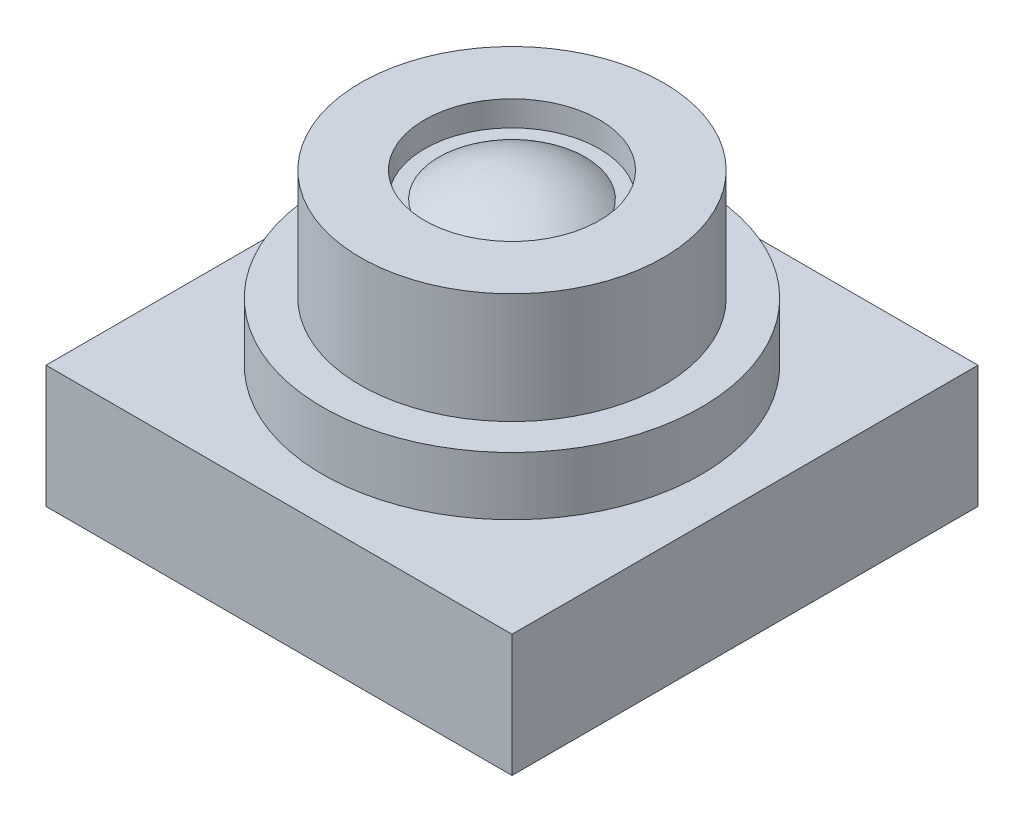
ISO-10303-21;
HEADER;
FILE_DESCRIPTION(('STEP AP214'),'2;1');
FILE_NAME('part.step','',(''),(''),'','','');
FILE_SCHEMA(('AUTOMOTIVE_DESIGN { 1 0 10303 214 1 1 1 1 }'));
ENDSEC;
DATA;
#1=APPLICATION_CONTEXT('core data for automotive mechanical design processes');
#2=APPLICATION_PROTOCOL_DEFINITION('international standard','automotive_design',2000,#1);
#3=PRODUCT_CONTEXT('',#1,'mechanical');
#4=PRODUCT('Part','Part','',(#3));
#5=PRODUCT_RELATED_PRODUCT_CATEGORY('part','',(#4));
#6=PRODUCT_DEFINITION_FORMATION('','',#4);
#7=PRODUCT_DEFINITION_CONTEXT('part definition',#1,'design');
#8=PRODUCT_DEFINITION('design','',#6,#7);
#9=PRODUCT_DEFINITION_SHAPE('','',#8);
#10=(LENGTH_UNIT() NAMED_UNIT(*) SI_UNIT(.MILLI.,.METRE.));
#11=(NAMED_UNIT(*) PLANE_ANGLE_UNIT() SI_UNIT($,.RADIAN.));
#12=(NAMED_UNIT(*) SI_UNIT($,.STERADIAN.) SOLID_ANGLE_UNIT());
#13=UNCERTAINTY_MEASURE_WITH_UNIT(LENGTH_MEASURE(1.E-05),#10,'distance_accuracy_value','');
#14=(GEOMETRIC_REPRESENTATION_CONTEXT(3) GLOBAL_UNCERTAINTY_ASSIGNED_CONTEXT((#13)) GLOBAL_UNIT_ASSIGNED_CONTEXT((#10,
#11,#12)) REPRESENTATION_CONTEXT('',''));
#15=CARTESIAN_POINT('',(0.,0.,0.));
#16=DIRECTION('',(0.,0.,1.));
#17=DIRECTION('',(1.,0.,0.));
#18=AXIS2_PLACEMENT_3D('',#15,#16,#17);
#19=CARTESIAN_POINT('',(-4.,2.1,4.));
#20=DIRECTION('',(1.,0.,0.));
#21=DIRECTION('',(0.,0.,-1.));
#22=AXIS2_PLACEMENT_3D('',#19,#20,#21);
#23=PLANE('',#22);
#24=DIRECTION('',(0.,0.,1.));
#25=VECTOR('',#24,1.);
#26=CARTESIAN_POINT('',(-4.,0.,4.));
#27=LINE('',#26,#25);
#28=CARTESIAN_POINT('',(-4.,0.,-4.));
#29=VERTEX_POINT('',#28);
#30=CARTESIAN_POINT('',(-4.,0.,4.));
#31=VERTEX_POINT('',#30);
#32=EDGE_CURVE('E95',#29,#31,#27,.T.);
#33=ORIENTED_EDGE('',*,*,#32,.T.);
#34=DIRECTION('',(0.,-1.,0.));
#35=VECTOR('',#34,1.);
#36=CARTESIAN_POINT('',(-4.,2.1,4.));
#37=LINE('',#36,#35);
#38=CARTESIAN_POINT('',(-4.,2.1,4.));
#39=VERTEX_POINT('',#38);
#40=EDGE_CURVE('E11',#39,#31,#37,.T.);
#41=ORIENTED_EDGE('',*,*,#40,.F.);
#42=DIRECTION('',(0.,0.,1.));
#43=VECTOR('',#42,1.);
#44=CARTESIAN_POINT('',(-4.,2.1,4.));
#45=LINE('',#44,#43);
#46=CARTESIAN_POINT('',(-4.,2.1,-4.));
#47=VERTEX_POINT('',#46);
#48=EDGE_CURVE('E83',#47,#39,#45,.T.);
#49=ORIENTED_EDGE('',*,*,#48,.F.);
#50=DIRECTION('',(0.,-1.,0.));
#51=VECTOR('',#50,1.);
#52=CARTESIAN_POINT('',(-4.,2.1,-4.));
#53=LINE('',#52,#51);
#54=EDGE_CURVE('E91',#47,#29,#53,.T.);
#55=ORIENTED_EDGE('',*,*,#54,.T.);
#56=EDGE_LOOP('',(#33,#41,#49,#55));
#57=FACE_BOUND('',#56,.T.);
#58=ADVANCED_FACE('F32',(#57),#23,.F.);
#59=CARTESIAN_POINT('',(-4.,2.1,4.));
#60=DIRECTION('',(0.,0.,-1.));
#61=DIRECTION('',(-1.,0.,0.));
#62=AXIS2_PLACEMENT_3D('',#59,#60,#61);
#63=PLANE('',#62);
#64=DIRECTION('',(1.,0.,0.));
#65=VECTOR('',#64,1.);
#66=CARTESIAN_POINT('',(-4.,0.,4.));
#67=LINE('',#66,#65);
#68=CARTESIAN_POINT('',(4.,0.,4.));
#69=VERTEX_POINT('',#68);
#70=EDGE_CURVE('E87',#31,#69,#67,.T.);
#71=ORIENTED_EDGE('',*,*,#70,.T.);
#72=DIRECTION('',(0.,-1.,0.));
#73=VECTOR('',#72,1.);
#74=CARTESIAN_POINT('',(4.,2.1,4.));
#75=LINE('',#74,#73);
#76=CARTESIAN_POINT('',(4.,2.1,4.));
#77=VERTEX_POINT('',#76);
#78=EDGE_CURVE('E40',#77,#69,#75,.T.);
#79=ORIENTED_EDGE('',*,*,#78,.F.);
#80=DIRECTION('',(1.,0.,0.));
#81=VECTOR('',#80,1.);
#82=CARTESIAN_POINT('',(-4.,2.1,4.));
#83=LINE('',#82,#81);
#84=EDGE_CURVE('E78',#39,#77,#83,.T.);
#85=ORIENTED_EDGE('',*,*,#84,.F.);
#86=ORIENTED_EDGE('',*,*,#40,.T.);
#87=EDGE_LOOP('',(#71,#79,#85,#86));
#88=FACE_BOUND('',#87,.T.);
#89=ADVANCED_FACE('F86',(#88),#63,.F.);
#90=CARTESIAN_POINT('',(4.,2.1,4.));
#91=DIRECTION('',(-1.,0.,0.));
#92=DIRECTION('',(0.,0.,1.));
#93=AXIS2_PLACEMENT_3D('',#90,#91,#92);
#94=PLANE('',#93);
#95=DIRECTION('',(0.,0.,-1.));
#96=VECTOR('',#95,1.);
#97=CARTESIAN_POINT('',(4.,0.,4.));
#98=LINE('',#97,#96);
#99=CARTESIAN_POINT('',(4.,0.,-4.));
#100=VERTEX_POINT('',#99);
#101=EDGE_CURVE('E65',#69,#100,#98,.T.);
#102=ORIENTED_EDGE('',*,*,#101,.T.);
#103=DIRECTION('',(0.,-1.,0.));
#104=VECTOR('',#103,1.);
#105=CARTESIAN_POINT('',(4.,2.1,-4.));
#106=LINE('',#105,#104);
#107=CARTESIAN_POINT('',(4.,2.1,-4.));
#108=VERTEX_POINT('',#107);
#109=EDGE_CURVE('E88',#108,#100,#106,.T.);
#110=ORIENTED_EDGE('',*,*,#109,.F.);
#111=DIRECTION('',(0.,0.,-1.));
#112=VECTOR('',#111,1.);
#113=CARTESIAN_POINT('',(4.,2.1,4.));
#114=LINE('',#113,#112);
#115=EDGE_CURVE('E81',#77,#108,#114,.T.);
#116=ORIENTED_EDGE('',*,*,#115,.F.);
#117=ORIENTED_EDGE('',*,*,#78,.T.);
#118=EDGE_LOOP('',(#102,#110,#116,#117));
#119=FACE_BOUND('',#118,.T.);
#120=ADVANCED_FACE('F89',(#119),#94,.F.);
#121=CARTESIAN_POINT('',(-4.,2.1,-4.));
#122=DIRECTION('',(0.,0.,1.));
#123=DIRECTION('',(1.,0.,0.));
#124=AXIS2_PLACEMENT_3D('',#121,#122,#123);
#125=PLANE('',#124);
#126=DIRECTION('',(-1.,0.,0.));
#127=VECTOR('',#126,1.);
#128=CARTESIAN_POINT('',(-4.,0.,-4.));
#129=LINE('',#128,#127);
#130=EDGE_CURVE('E71',#100,#29,#129,.T.);
#131=ORIENTED_EDGE('',*,*,#130,.T.);
#132=ORIENTED_EDGE('',*,*,#54,.F.);
#133=DIRECTION('',(-1.,0.,0.));
#134=VECTOR('',#133,1.);
#135=CARTESIAN_POINT('',(-4.,2.1,-4.));
#136=LINE('',#135,#134);
#137=EDGE_CURVE('E48',#108,#47,#136,.T.);
#138=ORIENTED_EDGE('',*,*,#137,.F.);
#139=ORIENTED_EDGE('',*,*,#109,.T.);
#140=EDGE_LOOP('',(#131,#132,#138,#139));
#141=FACE_BOUND('',#140,.T.);
#142=ADVANCED_FACE('F103',(#141),#125,.F.);
#143=CARTESIAN_POINT('',(0.,2.1,0.));
#144=DIRECTION('',(0.,-1.,0.));
#145=DIRECTION('',(0.,0.,-1.));
#146=AXIS2_PLACEMENT_3D('',#143,#144,#145);
#147=PLANE('',#146);
#148=CARTESIAN_POINT('',(0.,2.1,0.));
#149=DIRECTION('',(0.,-1.,0.));
#150=DIRECTION('',(0.,0.,-1.));
#151=AXIS2_PLACEMENT_3D('',#148,#149,#150);
#152=CIRCLE('',#151,3.25);
#153=CARTESIAN_POINT('',(0.,2.1,-3.25));
#154=VERTEX_POINT('',#153);
#155=EDGE_CURVE('E126',#154,#154,#152,.T.);
#156=ORIENTED_EDGE('',*,*,#155,.T.);
#157=EDGE_LOOP('',(#156));
#158=FACE_BOUND('',#157,.T.);
#159=ORIENTED_EDGE('',*,*,#48,.T.);
#160=ORIENTED_EDGE('',*,*,#84,.T.);
#161=ORIENTED_EDGE('',*,*,#115,.T.);
#162=ORIENTED_EDGE('',*,*,#137,.T.);
#163=EDGE_LOOP('',(#159,#160,#161,#162));
#164=FACE_BOUND('',#163,.T.);
#165=ADVANCED_FACE('F79',(#158,#164),#147,.F.);
#166=CARTESIAN_POINT('',(0.,0.,0.));
#167=DIRECTION('',(0.,-1.,0.));
#168=DIRECTION('',(0.,0.,-1.));
#169=AXIS2_PLACEMENT_3D('',#166,#167,#168);
#170=PLANE('',#169);
#171=ORIENTED_EDGE('',*,*,#32,.F.);
#172=ORIENTED_EDGE('',*,*,#130,.F.);
#173=ORIENTED_EDGE('',*,*,#101,.F.);
#174=ORIENTED_EDGE('',*,*,#70,.F.);
#175=EDGE_LOOP('',(#171,#172,#173,#174));
#176=FACE_BOUND('',#175,.T.);
#177=ADVANCED_FACE('F106',(#176),#170,.T.);
#178=CARTESIAN_POINT('',(0.,2.95967880212872,0.));
#179=DIRECTION('',(0.,-1.,0.));
#180=DIRECTION('',(0.,0.,-1.));
#181=AXIS2_PLACEMENT_3D('',#178,#179,#180);
#182=SPHERICAL_SURFACE('',#181,2.04032119787128);
#183=CARTESIAN_POINT('',(0.,4.56807478430648,0.));
#184=DIRECTION('',(0.,-1.,0.));
#185=DIRECTION('',(0.,0.,-1.));
#186=AXIS2_PLACEMENT_3D('',#183,#184,#185);
#187=CIRCLE('',#186,1.25537761450384);
#188=CARTESIAN_POINT('',(0.,4.56807478430648,-1.25537761450384));
#189=VERTEX_POINT('',#188);
#190=EDGE_CURVE('E98',#189,#189,#187,.T.);
#191=ORIENTED_EDGE('',*,*,#190,.F.);
#192=EDGE_LOOP('',(#191));
#193=FACE_BOUND('',#192,.T.);
#194=ADVANCED_FACE('F164',(#193),#182,.T.);
#195=CARTESIAN_POINT('',(0.,4.56807478430648,1.5));
#196=DIRECTION('',(0.,-1.,0.));
#197=DIRECTION('',(0.,0.,-1.));
#198=AXIS2_PLACEMENT_3D('',#195,#196,#197);
#199=PLANE('',#198);
#200=CARTESIAN_POINT('',(0.,4.56807478430648,0.));
#201=DIRECTION('',(0.,-1.,0.));
#202=DIRECTION('',(0.,0.,-1.));
#203=AXIS2_PLACEMENT_3D('',#200,#201,#202);
#204=CIRCLE('',#203,1.5);
#205=CARTESIAN_POINT('',(0.,4.56807478430648,-1.5));
#206=VERTEX_POINT('',#205);
#207=EDGE_CURVE('E111',#206,#206,#204,.T.);
#208=ORIENTED_EDGE('',*,*,#207,.F.);
#209=EDGE_LOOP('',(#208));
#210=FACE_BOUND('',#209,.T.);
#211=ORIENTED_EDGE('',*,*,#190,.T.);
#212=EDGE_LOOP('',(#211));
#213=FACE_BOUND('',#212,.T.);
#214=ADVANCED_FACE('F158',(#210,#213),#199,.F.);
#215=CARTESIAN_POINT('',(0.,0.,0.));
#216=DIRECTION('',(0.,-1.,0.));
#217=DIRECTION('',(0.,0.,-1.));
#218=AXIS2_PLACEMENT_3D('',#215,#216,#217);
#219=CYLINDRICAL_SURFACE('',#218,1.5);
#220=CARTESIAN_POINT('',(0.,5.,0.));
#221=DIRECTION('',(0.,-1.,0.));
#222=DIRECTION('',(0.,0.,-1.));
#223=AXIS2_PLACEMENT_3D('',#220,#221,#222);
#224=CIRCLE('',#223,1.5);
#225=CARTESIAN_POINT('',(0.,5.,-1.5));
#226=VERTEX_POINT('',#225);
#227=EDGE_CURVE('E114',#226,#226,#224,.T.);
#228=ORIENTED_EDGE('',*,*,#227,.F.);
#229=EDGE_LOOP('',(#228));
#230=FACE_BOUND('',#229,.T.);
#231=ORIENTED_EDGE('',*,*,#207,.T.);
#232=EDGE_LOOP('',(#231));
#233=FACE_BOUND('',#232,.T.);
#234=ADVANCED_FACE('F152',(#230,#233),#219,.F.);
#235=CARTESIAN_POINT('',(0.,5.,2.6));
#236=DIRECTION('',(0.,-1.,0.));
#237=DIRECTION('',(0.,0.,-1.));
#238=AXIS2_PLACEMENT_3D('',#235,#236,#237);
#239=PLANE('',#238);
#240=CARTESIAN_POINT('',(0.,5.,0.));
#241=DIRECTION('',(0.,-1.,0.));
#242=DIRECTION('',(0.,0.,-1.));
#243=AXIS2_PLACEMENT_3D('',#240,#241,#242);
#244=CIRCLE('',#243,2.6);
#245=CARTESIAN_POINT('',(0.,5.,-2.6));
#246=VERTEX_POINT('',#245);
#247=EDGE_CURVE('E117',#246,#246,#244,.T.);
#248=ORIENTED_EDGE('',*,*,#247,.F.);
#249=EDGE_LOOP('',(#248));
#250=FACE_BOUND('',#249,.T.);
#251=ORIENTED_EDGE('',*,*,#227,.T.);
#252=EDGE_LOOP('',(#251));
#253=FACE_BOUND('',#252,.T.);
#254=ADVANCED_FACE('F146',(#250,#253),#239,.F.);
#255=CARTESIAN_POINT('',(0.,0.,0.));
#256=DIRECTION('',(0.,-1.,0.));
#257=DIRECTION('',(0.,0.,-1.));
#258=AXIS2_PLACEMENT_3D('',#255,#256,#257);
#259=CYLINDRICAL_SURFACE('',#258,2.6);
#260=CARTESIAN_POINT('',(0.,3.1,0.));
#261=DIRECTION('',(0.,-1.,0.));
#262=DIRECTION('',(0.,0.,-1.));
#263=AXIS2_PLACEMENT_3D('',#260,#261,#262);
#264=CIRCLE('',#263,2.6);
#265=CARTESIAN_POINT('',(0.,3.1,-2.6));
#266=VERTEX_POINT('',#265);
#267=EDGE_CURVE('E120',#266,#266,#264,.T.);
#268=ORIENTED_EDGE('',*,*,#267,.F.);
#269=EDGE_LOOP('',(#268));
#270=FACE_BOUND('',#269,.T.);
#271=ORIENTED_EDGE('',*,*,#247,.T.);
#272=EDGE_LOOP('',(#271));
#273=FACE_BOUND('',#272,.T.);
#274=ADVANCED_FACE('F140',(#270,#273),#259,.T.);
#275=CARTESIAN_POINT('',(0.,3.1,3.25));
#276=DIRECTION('',(0.,-1.,0.));
#277=DIRECTION('',(0.,0.,-1.));
#278=AXIS2_PLACEMENT_3D('',#275,#276,#277);
#279=PLANE('',#278);
#280=CARTESIAN_POINT('',(0.,3.1,0.));
#281=DIRECTION('',(0.,-1.,0.));
#282=DIRECTION('',(0.,0.,-1.));
#283=AXIS2_PLACEMENT_3D('',#280,#281,#282);
#284=CIRCLE('',#283,3.25);
#285=CARTESIAN_POINT('',(0.,3.1,-3.25));
#286=VERTEX_POINT('',#285);
#287=EDGE_CURVE('E123',#286,#286,#284,.T.);
#288=ORIENTED_EDGE('',*,*,#287,.F.);
#289=EDGE_LOOP('',(#288));
#290=FACE_BOUND('',#289,.T.);
#291=ORIENTED_EDGE('',*,*,#267,.T.);
#292=EDGE_LOOP('',(#291));
#293=FACE_BOUND('',#292,.T.);
#294=ADVANCED_FACE('F134',(#290,#293),#279,.F.);
#295=CARTESIAN_POINT('',(0.,0.,0.));
#296=DIRECTION('',(0.,-1.,0.));
#297=DIRECTION('',(0.,0.,-1.));
#298=AXIS2_PLACEMENT_3D('',#295,#296,#297);
#299=CYLINDRICAL_SURFACE('',#298,3.25);
#300=ORIENTED_EDGE('',*,*,#155,.F.);
#301=EDGE_LOOP('',(#300));
#302=FACE_BOUND('',#301,.T.);
#303=ORIENTED_EDGE('',*,*,#287,.T.);
#304=EDGE_LOOP('',(#303));
#305=FACE_BOUND('',#304,.T.);
#306=ADVANCED_FACE('F131',(#302,#305),#299,.T.);
#307=CLOSED_SHELL('',(#58,#89,#120,#142,#165,#177,#194,#214,#234,#254,#274,#294,#306));
#308=MANIFOLD_SOLID_BREP('B2',#307);
#309=ADVANCED_BREP_SHAPE_REPRESENTATION('',(#18,#308),#14);
#310=SHAPE_DEFINITION_REPRESENTATION(#9,#309);
ENDSEC;
END-ISO-10303-21;
